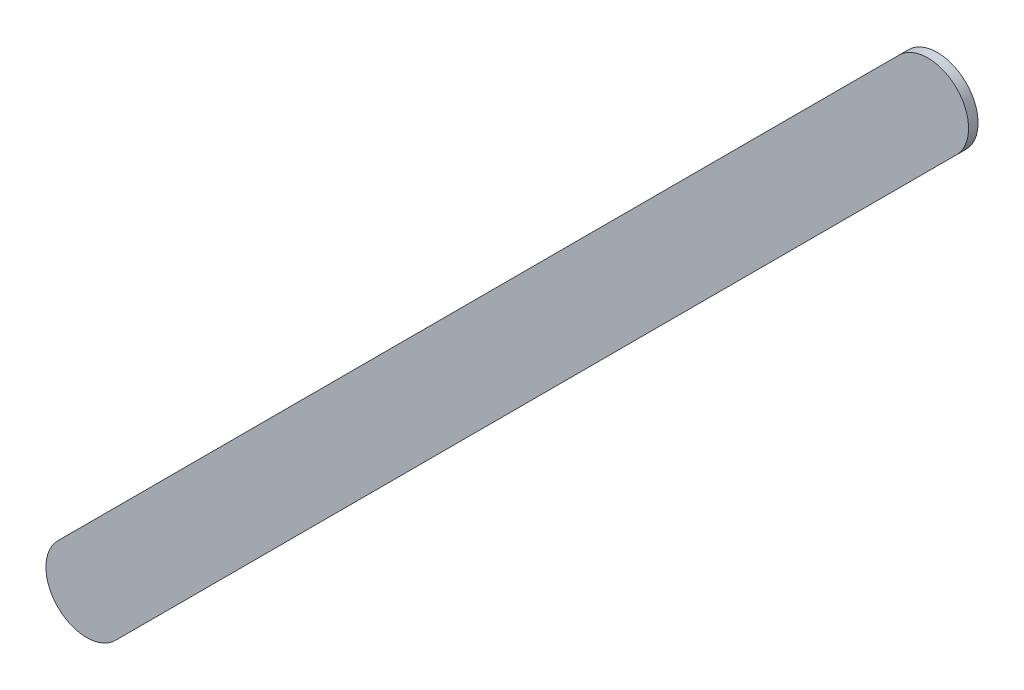
ISO-10303-21;
HEADER;
FILE_DESCRIPTION(('STEP AP214'),'2;1');
FILE_NAME('part.step','',(''),(''),'','','');
FILE_SCHEMA(('AUTOMOTIVE_DESIGN { 1 0 10303 214 1 1 1 1 }'));
ENDSEC;
DATA;
#1=APPLICATION_CONTEXT('core data for automotive mechanical design processes');
#2=APPLICATION_PROTOCOL_DEFINITION('international standard','automotive_design',2000,#1);
#3=PRODUCT_CONTEXT('',#1,'mechanical');
#4=PRODUCT('Part','Part','',(#3));
#5=PRODUCT_RELATED_PRODUCT_CATEGORY('part','',(#4));
#6=PRODUCT_DEFINITION_FORMATION('','',#4);
#7=PRODUCT_DEFINITION_CONTEXT('part definition',#1,'design');
#8=PRODUCT_DEFINITION('design','',#6,#7);
#9=PRODUCT_DEFINITION_SHAPE('','',#8);
#10=(LENGTH_UNIT() NAMED_UNIT(*) SI_UNIT(.MILLI.,.METRE.));
#11=(NAMED_UNIT(*) PLANE_ANGLE_UNIT() SI_UNIT($,.RADIAN.));
#12=(NAMED_UNIT(*) SI_UNIT($,.STERADIAN.) SOLID_ANGLE_UNIT());
#13=UNCERTAINTY_MEASURE_WITH_UNIT(LENGTH_MEASURE(1.E-05),#10,'distance_accuracy_value','');
#14=(GEOMETRIC_REPRESENTATION_CONTEXT(3) GLOBAL_UNCERTAINTY_ASSIGNED_CONTEXT((#13)) GLOBAL_UNIT_ASSIGNED_CONTEXT((#10,
#11,#12)) REPRESENTATION_CONTEXT('',''));
#15=CARTESIAN_POINT('',(0.,0.,0.));
#16=DIRECTION('',(0.,0.,1.));
#17=DIRECTION('',(1.,0.,0.));
#18=AXIS2_PLACEMENT_3D('',#15,#16,#17);
#19=CARTESIAN_POINT('',(127.573933,-75.903933,1.635));
#20=DIRECTION('',(0.,0.,1.));
#21=DIRECTION('',(1.,0.,0.));
#22=AXIS2_PLACEMENT_3D('',#19,#20,#21);
#23=PLANE('',#22);
#24=DIRECTION('',(-0.707106781186548,-0.707106781186548,0.));
#25=VECTOR('',#24,1.);
#26=CARTESIAN_POINT('',(127.573933,-75.903933,1.635));
#27=LINE('',#26,#25);
#28=CARTESIAN_POINT('',(127.573933,-75.903933,1.635));
#29=VERTEX_POINT('',#28);
#30=CARTESIAN_POINT('',(124.473933,-79.003933,1.635));
#31=VERTEX_POINT('',#30);
#32=EDGE_CURVE('E70',#29,#31,#27,.T.);
#33=ORIENTED_EDGE('',*,*,#32,.T.);
#34=CARTESIAN_POINT('',(124.5799995,-79.1099995,1.635));
#35=DIRECTION('',(0.,0.,1.));
#36=DIRECTION('',(-0.707106781186548,0.707106781186548,0.));
#37=AXIS2_PLACEMENT_3D('',#34,#35,#36);
#38=CIRCLE('',#37,0.150000682813);
#39=CARTESIAN_POINT('',(124.686066,-79.216066,1.635));
#40=VERTEX_POINT('',#39);
#41=EDGE_CURVE('E67',#31,#40,#38,.T.);
#42=ORIENTED_EDGE('',*,*,#41,.T.);
#43=DIRECTION('',(0.707106781186548,0.707106781186548,0.));
#44=VECTOR('',#43,1.);
#45=CARTESIAN_POINT('',(124.686066,-79.216066,1.635));
#46=LINE('',#45,#44);
#47=CARTESIAN_POINT('',(127.786066,-76.116066,1.635));
#48=VERTEX_POINT('',#47);
#49=EDGE_CURVE('E54',#40,#48,#46,.T.);
#50=ORIENTED_EDGE('',*,*,#49,.T.);
#51=CARTESIAN_POINT('',(127.6799995,-76.0099995,1.635));
#52=DIRECTION('',(0.,0.,1.));
#53=DIRECTION('',(0.707106781186548,-0.707106781186548,0.));
#54=AXIS2_PLACEMENT_3D('',#51,#52,#53);
#55=CIRCLE('',#54,0.150000682813);
#56=EDGE_CURVE('E11',#48,#29,#55,.T.);
#57=ORIENTED_EDGE('',*,*,#56,.T.);
#58=EDGE_LOOP('',(#33,#42,#50,#57));
#59=FACE_BOUND('',#58,.T.);
#60=ADVANCED_FACE('F17',(#59),#23,.T.);
#61=CARTESIAN_POINT('',(127.573933,-75.903933,1.6));
#62=DIRECTION('',(0.,0.,1.));
#63=DIRECTION('',(1.,0.,0.));
#64=AXIS2_PLACEMENT_3D('',#61,#62,#63);
#65=PLANE('',#64);
#66=CARTESIAN_POINT('',(127.6799995,-76.0099995,1.6));
#67=DIRECTION('',(0.,0.,1.));
#68=DIRECTION('',(0.707106781186548,-0.707106781186548,0.));
#69=AXIS2_PLACEMENT_3D('',#66,#67,#68);
#70=CIRCLE('',#69,0.150000682813);
#71=CARTESIAN_POINT('',(127.786066,-76.116066,1.6));
#72=VERTEX_POINT('',#71);
#73=CARTESIAN_POINT('',(127.573933,-75.903933,1.6));
#74=VERTEX_POINT('',#73);
#75=EDGE_CURVE('E27',#72,#74,#70,.T.);
#76=ORIENTED_EDGE('',*,*,#75,.F.);
#77=DIRECTION('',(0.707106781186548,0.707106781186548,0.));
#78=VECTOR('',#77,1.);
#79=CARTESIAN_POINT('',(124.686066,-79.216066,1.6));
#80=LINE('',#79,#78);
#81=CARTESIAN_POINT('',(124.686066,-79.216066,1.6));
#82=VERTEX_POINT('',#81);
#83=EDGE_CURVE('E75',#82,#72,#80,.T.);
#84=ORIENTED_EDGE('',*,*,#83,.F.);
#85=CARTESIAN_POINT('',(124.5799995,-79.1099995,1.6));
#86=DIRECTION('',(0.,0.,1.));
#87=DIRECTION('',(-0.707106781186548,0.707106781186548,0.));
#88=AXIS2_PLACEMENT_3D('',#85,#86,#87);
#89=CIRCLE('',#88,0.150000682813);
#90=CARTESIAN_POINT('',(124.473933,-79.003933,1.6));
#91=VERTEX_POINT('',#90);
#92=EDGE_CURVE('E79',#91,#82,#89,.T.);
#93=ORIENTED_EDGE('',*,*,#92,.F.);
#94=DIRECTION('',(-0.707106781186548,-0.707106781186548,0.));
#95=VECTOR('',#94,1.);
#96=CARTESIAN_POINT('',(127.573933,-75.903933,1.6));
#97=LINE('',#96,#95);
#98=EDGE_CURVE('E107',#74,#91,#97,.T.);
#99=ORIENTED_EDGE('',*,*,#98,.F.);
#100=EDGE_LOOP('',(#76,#84,#93,#99));
#101=FACE_BOUND('',#100,.T.);
#102=ADVANCED_FACE('F19',(#101),#65,.F.);
#103=CARTESIAN_POINT('',(127.6799995,-76.0099995,1.6));
#104=DIRECTION('',(0.,0.,-1.));
#105=DIRECTION('',(0.707106781186548,-0.707106781186548,0.));
#106=AXIS2_PLACEMENT_3D('',#103,#104,#105);
#107=CYLINDRICAL_SURFACE('',#106,0.150000682813);
#108=ORIENTED_EDGE('',*,*,#75,.T.);
#109=DIRECTION('',(0.,0.,1.));
#110=VECTOR('',#109,1.);
#111=CARTESIAN_POINT('',(127.573933,-75.903933,1.6));
#112=LINE('',#111,#110);
#113=EDGE_CURVE('E86',#74,#29,#112,.T.);
#114=ORIENTED_EDGE('',*,*,#113,.T.);
#115=ORIENTED_EDGE('',*,*,#56,.F.);
#116=DIRECTION('',(0.,0.,1.));
#117=VECTOR('',#116,1.);
#118=CARTESIAN_POINT('',(127.786066,-76.116066,1.6));
#119=LINE('',#118,#117);
#120=EDGE_CURVE('E61',#72,#48,#119,.T.);
#121=ORIENTED_EDGE('',*,*,#120,.F.);
#122=EDGE_LOOP('',(#108,#114,#115,#121));
#123=FACE_BOUND('',#122,.T.);
#124=ADVANCED_FACE('F98',(#123),#107,.T.);
#125=CARTESIAN_POINT('',(124.686066,-79.216066,1.6));
#126=DIRECTION('',(-0.707106781186548,0.707106781186548,0.));
#127=DIRECTION('',(0.,0.,1.));
#128=AXIS2_PLACEMENT_3D('',#125,#126,#127);
#129=PLANE('',#128);
#130=ORIENTED_EDGE('',*,*,#83,.T.);
#131=ORIENTED_EDGE('',*,*,#120,.T.);
#132=ORIENTED_EDGE('',*,*,#49,.F.);
#133=DIRECTION('',(0.,0.,1.));
#134=VECTOR('',#133,1.);
#135=CARTESIAN_POINT('',(124.686066,-79.216066,1.6));
#136=LINE('',#135,#134);
#137=EDGE_CURVE('E59',#82,#40,#136,.T.);
#138=ORIENTED_EDGE('',*,*,#137,.F.);
#139=EDGE_LOOP('',(#130,#131,#132,#138));
#140=FACE_BOUND('',#139,.T.);
#141=ADVANCED_FACE('F57',(#140),#129,.F.);
#142=CARTESIAN_POINT('',(124.5799995,-79.1099995,1.6));
#143=DIRECTION('',(0.,0.,-1.));
#144=DIRECTION('',(-0.707106781186548,0.707106781186548,0.));
#145=AXIS2_PLACEMENT_3D('',#142,#143,#144);
#146=CYLINDRICAL_SURFACE('',#145,0.150000682813);
#147=ORIENTED_EDGE('',*,*,#92,.T.);
#148=ORIENTED_EDGE('',*,*,#137,.T.);
#149=ORIENTED_EDGE('',*,*,#41,.F.);
#150=DIRECTION('',(0.,0.,1.));
#151=VECTOR('',#150,1.);
#152=CARTESIAN_POINT('',(124.473933,-79.003933,1.6));
#153=LINE('',#152,#151);
#154=EDGE_CURVE('E111',#91,#31,#153,.T.);
#155=ORIENTED_EDGE('',*,*,#154,.F.);
#156=EDGE_LOOP('',(#147,#148,#149,#155));
#157=FACE_BOUND('',#156,.T.);
#158=ADVANCED_FACE('F77',(#157),#146,.T.);
#159=CARTESIAN_POINT('',(127.573933,-75.903933,1.6));
#160=DIRECTION('',(0.707106781186548,-0.707106781186548,0.));
#161=DIRECTION('',(0.,0.,-1.));
#162=AXIS2_PLACEMENT_3D('',#159,#160,#161);
#163=PLANE('',#162);
#164=ORIENTED_EDGE('',*,*,#98,.T.);
#165=ORIENTED_EDGE('',*,*,#154,.T.);
#166=ORIENTED_EDGE('',*,*,#32,.F.);
#167=ORIENTED_EDGE('',*,*,#113,.F.);
#168=EDGE_LOOP('',(#164,#165,#166,#167));
#169=FACE_BOUND('',#168,.T.);
#170=ADVANCED_FACE('F106',(#169),#163,.F.);
#171=CLOSED_SHELL('',(#60,#102,#124,#141,#158,#170));
#172=MANIFOLD_SOLID_BREP('B1',#171);
#173=ADVANCED_BREP_SHAPE_REPRESENTATION('',(#18,#172),#14);
#174=SHAPE_DEFINITION_REPRESENTATION(#9,#173);
ENDSEC;
END-ISO-10303-21;
